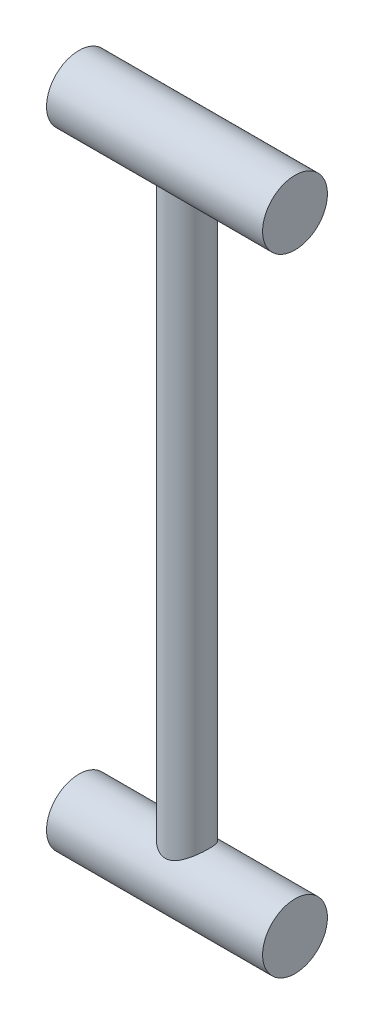
ISO-10303-21;
HEADER;
FILE_DESCRIPTION(('STEP AP214'),'2;1');
FILE_NAME('part.step','',(''),(''),'','','');
FILE_SCHEMA(('AUTOMOTIVE_DESIGN { 1 0 10303 214 1 1 1 1 }'));
ENDSEC;
DATA;
#1=APPLICATION_CONTEXT('core data for automotive mechanical design processes');
#2=APPLICATION_PROTOCOL_DEFINITION('international standard','automotive_design',2000,#1);
#3=PRODUCT_CONTEXT('',#1,'mechanical');
#4=PRODUCT('Part','Part','',(#3));
#5=PRODUCT_RELATED_PRODUCT_CATEGORY('part','',(#4));
#6=PRODUCT_DEFINITION_FORMATION('','',#4);
#7=PRODUCT_DEFINITION_CONTEXT('part definition',#1,'design');
#8=PRODUCT_DEFINITION('design','',#6,#7);
#9=PRODUCT_DEFINITION_SHAPE('','',#8);
#10=(LENGTH_UNIT() NAMED_UNIT(*) SI_UNIT(.MILLI.,.METRE.));
#11=(NAMED_UNIT(*) PLANE_ANGLE_UNIT() SI_UNIT($,.RADIAN.));
#12=(NAMED_UNIT(*) SI_UNIT($,.STERADIAN.) SOLID_ANGLE_UNIT());
#13=UNCERTAINTY_MEASURE_WITH_UNIT(LENGTH_MEASURE(1.E-05),#10,'distance_accuracy_value','');
#14=(GEOMETRIC_REPRESENTATION_CONTEXT(3) GLOBAL_UNCERTAINTY_ASSIGNED_CONTEXT((#13)) GLOBAL_UNIT_ASSIGNED_CONTEXT((#10,
#11,#12)) REPRESENTATION_CONTEXT('',''));
#15=CARTESIAN_POINT('',(0.,0.,0.));
#16=DIRECTION('',(0.,0.,1.));
#17=DIRECTION('',(1.,0.,0.));
#18=AXIS2_PLACEMENT_3D('',#15,#16,#17);
#19=CARTESIAN_POINT('',(50.,145.,0.));
#20=DIRECTION('',(-1.,0.,0.));
#21=DIRECTION('',(0.,0.,1.));
#22=AXIS2_PLACEMENT_3D('',#19,#20,#21);
#23=CYLINDRICAL_SURFACE('',#22,15.);
#24=CARTESIAN_POINT('',(0.,133.819660112501,10.));
#25=CARTESIAN_POINT('',(-0.244104634083735,133.819656974059,9.99999812169869));
#26=CARTESIAN_POINT('',(-0.488234877021475,133.811628913883,9.99104298688126));
#27=CARTESIAN_POINT('',(-0.974178674876098,133.779920593774,9.95541902056754));
#28=CARTESIAN_POINT('',(-1.21599185412102,133.75623783785,9.92874736433802));
#29=CARTESIAN_POINT('',(-1.69550479304913,133.694331734234,9.85819750719936));
#30=CARTESIAN_POINT('',(-1.93319895251672,133.65609000061,9.81429754720628));
#31=CARTESIAN_POINT('',(-2.40254294819922,133.566757899766,9.71008060552601));
#32=CARTESIAN_POINT('',(-2.63418959874925,133.515660905692,9.64975515521691));
#33=CARTESIAN_POINT('',(-3.3133509027849,133.347209971556,9.4468623449172));
#34=CARTESIAN_POINT('',(-3.75031310169313,133.21394511653,9.28157856239411));
#35=CARTESIAN_POINT('',(-4.5894545697837,132.920772054826,8.89665774912812));
#36=CARTESIAN_POINT('',(-4.99162659197015,132.760858317235,8.67700943055291));
#37=CARTESIAN_POINT('',(-5.59668354535961,132.498673505283,8.29133076792018));
#38=CARTESIAN_POINT('',(-5.81208580089952,132.400534017285,8.14175321020326));
#39=CARTESIAN_POINT('',(-6.22995308437643,132.202405118669,7.82663116288371));
#40=CARTESIAN_POINT('',(-6.43242046957811,132.102416049427,7.661089596458));
#41=CARTESIAN_POINT('',(-6.82407478250955,131.902687021171,7.314401504072));
#42=CARTESIAN_POINT('',(-7.01324763966898,131.802947430712,7.13323888356033));
#43=CARTESIAN_POINT('',(-7.37740647406724,131.605871214888,6.75593222846196));
#44=CARTESIAN_POINT('',(-7.55239147273011,131.508534755596,6.55978716230338));
#45=CARTESIAN_POINT('',(-7.91159105003275,131.30443976727,6.12353647276974));
#46=CARTESIAN_POINT('',(-8.09346990419511,131.198359251755,5.8811789501792));
#47=CARTESIAN_POINT('',(-8.43590832447264,130.994800859044,5.37846826366159));
#48=CARTESIAN_POINT('',(-8.59647059439671,130.897321891349,5.11811738840481));
#49=CARTESIAN_POINT('',(-8.89437994302583,130.713774422958,4.58085923760313));
#50=CARTESIAN_POINT('',(-9.03174359126861,130.627697787741,4.30396397184124));
#51=CARTESIAN_POINT('',(-9.28138637708527,130.469521563324,3.73526924944096));
#52=CARTESIAN_POINT('',(-9.39367088779998,130.397418980658,3.44347300179124));
#53=CARTESIAN_POINT('',(-9.58011201957958,130.276750022004,2.8808291650135));
#54=CARTESIAN_POINT('',(-9.6571320762623,130.226451130115,2.6113011354144));
#55=CARTESIAN_POINT('',(-9.78860194671832,130.140179643733,2.06453336890579));
#56=CARTESIAN_POINT('',(-9.84305328300618,130.10420608284,1.78729415354961));
#57=CARTESIAN_POINT('',(-9.9283487325306,130.047706245426,1.22794421558455));
#58=CARTESIAN_POINT('',(-9.95921755725901,130.027163799424,0.945838909986496));
#59=CARTESIAN_POINT('',(-9.99683236708492,130.002118348232,0.37932954212427));
#60=CARTESIAN_POINT('',(-10.0035817558104,129.997613079946,0.0949258098814422));
#61=CARTESIAN_POINT('',(-9.99365946358264,130.004226137376,-0.429890300704853));
#62=CARTESIAN_POINT('',(-9.98039844294295,130.013069367043,-0.670405365119607));
#63=CARTESIAN_POINT('',(-9.9366582762118,130.042162336069,-1.14916921336001));
#64=CARTESIAN_POINT('',(-9.9061795075949,130.062411825363,-1.38741804675311));
#65=CARTESIAN_POINT('',(-9.82842604583959,130.113861775101,-1.85994144315074));
#66=CARTESIAN_POINT('',(-9.78115152384267,130.14506212396,-2.09421604662547));
#67=CARTESIAN_POINT('',(-9.67041911018337,130.217738276032,-2.55727832292994));
#68=CARTESIAN_POINT('',(-9.60696051911227,130.259214523325,-2.78606575815929));
#69=CARTESIAN_POINT('',(-9.46491431896903,130.351392666098,-3.23586010547906));
#70=CARTESIAN_POINT('',(-9.38639206481311,130.402054658201,-3.45689591892769));
#71=CARTESIAN_POINT('',(-9.21483712594954,130.511767741304,-3.89118359906177));
#72=CARTESIAN_POINT('',(-9.1217996714918,130.57082158933,-4.10443287853566));
#73=CARTESIAN_POINT('',(-8.9221009344861,130.696229569888,-4.52213369992451));
#74=CARTESIAN_POINT('',(-8.81544331188517,130.762581740588,-4.72658758563684));
#75=CARTESIAN_POINT('',(-8.58926725934447,130.901505532484,-5.12613031066347));
#76=CARTESIAN_POINT('',(-8.46974423598901,130.974079373145,-5.32121576891783));
#77=CARTESIAN_POINT('',(-8.20216850951354,131.134120779227,-5.726327688562));
#78=CARTESIAN_POINT('',(-8.05242961838,131.222293886169,-5.93496271084411));
#79=CARTESIAN_POINT('',(-7.73843625985693,131.403421736346,-6.33893458542772));
#80=CARTESIAN_POINT('',(-7.57417532544927,131.496378602124,-6.53426544381383));
#81=CARTESIAN_POINT('',(-7.23178051029879,131.685412506263,-6.91131642999311));
#82=CARTESIAN_POINT('',(-7.05362705509659,131.781493831722,-7.09301661883702));
#83=CARTESIAN_POINT('',(-6.68441263242746,131.974769116281,-7.44198477597034));
#84=CARTESIAN_POINT('',(-6.49335589388961,132.071962702258,-7.60925743221258));
#85=CARTESIAN_POINT('',(-6.06811166266616,132.280625260595,-7.95387515273785));
#86=CARTESIAN_POINT('',(-5.83183895186575,132.391962114428,-8.12873711272969));
#87=CARTESIAN_POINT('',(-5.34336756923514,132.610333174891,-8.45784659868074));
#88=CARTESIAN_POINT('',(-5.09116533284389,132.717366409665,-8.61208948645936));
#89=CARTESIAN_POINT('',(-4.57196567585117,132.923321187221,-8.89859009264868));
#90=CARTESIAN_POINT('',(-4.30499239286442,133.022255344884,-9.03088234401941));
#91=CARTESIAN_POINT('',(-3.75668599376629,133.208212509585,-9.27237806459456));
#92=CARTESIAN_POINT('',(-3.47535220753653,133.295234960075,-9.38158045510896));
#93=CARTESIAN_POINT('',(-2.98197209563971,133.430512831538,-9.54750949240308));
#94=CARTESIAN_POINT('',(-2.77304680410481,133.482746477737,-9.61031997608976));
#95=CARTESIAN_POINT('',(-2.34953877611093,133.577312742453,-9.72253074540317));
#96=CARTESIAN_POINT('',(-2.13495975612472,133.619651693049,-9.77193961062347));
#97=CARTESIAN_POINT('',(-1.70139224710651,133.692959815119,-9.85667224549281));
#98=CARTESIAN_POINT('',(-1.48240961155063,133.723943147146,-9.89201356226248));
#99=CARTESIAN_POINT('',(-1.0411686827613,133.773424841791,-9.94813645210465));
#100=CARTESIAN_POINT('',(-0.818910376293255,133.791923153953,-9.96891796633514));
#101=CARTESIAN_POINT('',(-0.371800856476382,133.815716711929,-9.99560576163432));
#102=CARTESIAN_POINT('',(-0.146942530983491,133.820953374016,-10.0014460405136));
#103=CARTESIAN_POINT('',(0.302560059924553,133.817825352334,-9.99794852994014));
#104=CARTESIAN_POINT('',(0.527204324825155,133.809460635953,-9.98861070409458));
#105=CARTESIAN_POINT('',(0.974621641486342,133.779482245064,-9.95492255357889));
#106=CARTESIAN_POINT('',(1.19739324495087,133.757859128793,-9.93056153029915));
#107=CARTESIAN_POINT('',(1.6392693955759,133.702250566451,-9.86725009281896));
#108=CARTESIAN_POINT('',(1.85837388137278,133.668264913729,-9.82829943473768));
#109=CARTESIAN_POINT('',(2.28089485594373,133.591166988451,-9.73867716321877));
#110=CARTESIAN_POINT('',(2.48455237317498,133.548586961413,-9.6886776896265));
#111=CARTESIAN_POINT('',(2.88648788657469,133.454716026798,-9.57662600790572));
#112=CARTESIAN_POINT('',(3.0847640261608,133.403422156147,-9.51456969891008));
#113=CARTESIAN_POINT('',(3.67047748529837,133.238532118733,-9.31119036842247));
#114=CARTESIAN_POINT('',(4.04901435576878,133.11388587182,-9.15261057859001));
#115=CARTESIAN_POINT('',(4.6323431509614,132.899707113,-8.86571968225688));
#116=CARTESIAN_POINT('',(4.84610463934114,132.816053741096,-8.75064580817112));
#117=CARTESIAN_POINT('',(5.26341966050908,132.644132046518,-8.50616497543067));
#118=CARTESIAN_POINT('',(5.46697225451772,132.555863300946,-8.37675670212528));
#119=CARTESIAN_POINT('',(5.86362637103519,132.376578677965,-8.10406654501132));
#120=CARTESIAN_POINT('',(6.05671627224182,132.285559913918,-7.96076970794571));
#121=CARTESIAN_POINT('',(6.43184385461758,132.10264331109,-7.66087764301208));
#122=CARTESIAN_POINT('',(6.61388092093514,132.010745423734,-7.50428167649492));
#123=CARTESIAN_POINT('',(7.00501199367109,131.807712398299,-7.14251026043374));
#124=CARTESIAN_POINT('',(7.21131788333415,131.696764999883,-6.93419991939919));
#125=CARTESIAN_POINT('',(7.605813647227,131.478854545019,-6.49906525353763));
#126=CARTESIAN_POINT('',(7.79400018787884,131.371892223951,-6.2722375360349));
#127=CARTESIAN_POINT('',(8.15079051936008,131.164743985722,-5.80102421685025));
#128=CARTESIAN_POINT('',(8.3194077996857,131.064553420786,-5.55665090006567));
#129=CARTESIAN_POINT('',(8.63560945832402,130.873504197794,-5.05124190702963));
#130=CARTESIAN_POINT('',(8.78319947641232,130.782643039307,-4.79021072592578));
#131=CARTESIAN_POINT('',(9.0294319874341,130.629082892862,-4.30448556628465));
#132=CARTESIAN_POINT('',(9.13203130163218,130.564326574372,-4.08244035052508));
#133=CARTESIAN_POINT('',(9.32137816893596,130.443806961212,-3.62934795833054));
#134=CARTESIAN_POINT('',(9.40812868268456,130.388041987138,-3.39830247299898));
#135=CARTESIAN_POINT('',(9.564772630882,130.286696133979,-2.92854633040624));
#136=CARTESIAN_POINT('',(9.63467675373536,130.241108798922,-2.68984064278836));
#137=CARTESIAN_POINT('',(9.75681098257684,130.161090664085,-2.20609679271157));
#138=CARTESIAN_POINT('',(9.80904083216604,130.126660026155,-1.96105853844224));
#139=CARTESIAN_POINT('',(9.89528026301976,130.069644401242,-1.46527060531758));
#140=CARTESIAN_POINT('',(9.92920666361757,130.047113502631,-1.21450016236396));
#141=CARTESIAN_POINT('',(9.97795750179072,130.014697088045,-0.710289408341561));
#142=CARTESIAN_POINT('',(9.9927819091241,130.004811592091,-0.456849093046524));
#143=CARTESIAN_POINT('',(10.0030913961553,129.997939380006,0.0505846961655423));
#144=CARTESIAN_POINT('',(9.99857762795915,130.000951895452,0.304578136228092));
#145=CARTESIAN_POINT('',(9.97028527280906,130.019797187459,0.810999942975637));
#146=CARTESIAN_POINT('',(9.94650756259925,130.035629380569,1.06342838036049));
#147=CARTESIAN_POINT('',(9.88248971342065,130.078100716761,1.54639987516089));
#148=CARTESIAN_POINT('',(9.84357507465467,130.103868536299,1.77719759813669));
#149=CARTESIAN_POINT('',(9.75001605952978,130.165527474989,2.23418451613698));
#150=CARTESIAN_POINT('',(9.69537259751012,130.20141800569,2.46037397822816));
#151=CARTESIAN_POINT('',(9.5710083281068,130.282595919454,2.90680088706522));
#152=CARTESIAN_POINT('',(9.50128911523188,130.327882308729,3.12703896049922));
#153=CARTESIAN_POINT('',(9.34748470402443,130.427010844309,3.56054098474613));
#154=CARTESIAN_POINT('',(9.26339391189295,130.480856321463,3.7738021813197));
#155=CARTESIAN_POINT('',(9.07643294016643,130.599440490844,4.20435065529124));
#156=CARTESIAN_POINT('',(8.97276186320523,130.66462705576,4.42116634154644));
#157=CARTESIAN_POINT('',(8.75114745704071,130.802287559172,4.84506473833996));
#158=CARTESIAN_POINT('',(8.63319816311674,130.874764541086,5.05214333070679));
#159=CARTESIAN_POINT('',(8.38391755943983,131.025729635485,5.45584279844941));
#160=CARTESIAN_POINT('',(8.25258314335167,131.104219142266,5.65246123010943));
#161=CARTESIAN_POINT('',(7.97735246721628,131.265891065643,6.03467657516068));
#162=CARTESIAN_POINT('',(7.83345479961898,131.349074007709,6.22027224967031));
#163=CARTESIAN_POINT('',(7.51020568644261,131.532158785367,6.60834585726704));
#164=CARTESIAN_POINT('',(7.32883957137959,131.632630640526,6.80887991263904));
#165=CARTESIAN_POINT('',(6.95120233992228,131.835886231142,7.19399132903166));
#166=CARTESIAN_POINT('',(6.75493436648316,131.938669475903,7.37857203731308));
#167=CARTESIAN_POINT('',(6.34800274615306,132.144406305686,7.73145903758045));
#168=CARTESIAN_POINT('',(6.13732629941372,132.247359960757,7.89975052986546));
#169=CARTESIAN_POINT('',(5.70233922468843,132.450907297695,8.21925441084574));
#170=CARTESIAN_POINT('',(5.47802992036077,132.551501207367,8.37046845358406));
#171=CARTESIAN_POINT('',(5.03390836898575,132.740188636846,8.6442187927183));
#172=CARTESIAN_POINT('',(4.81505896437095,132.828650299424,8.76806290035353));
#173=CARTESIAN_POINT('',(4.36657776521144,132.999000765507,8.99981674145526));
#174=CARTESIAN_POINT('',(4.13694564645788,133.080889371175,9.10772599539628));
#175=CARTESIAN_POINT('',(3.66788226081282,133.235459337208,9.30652559170291));
#176=CARTESIAN_POINT('',(3.42846735367455,133.308155298701,9.397443035655));
#177=CARTESIAN_POINT('',(2.94041923146927,133.441840049654,9.56138824931114));
#178=CARTESIAN_POINT('',(2.69178854788988,133.502832026068,9.6344208904837));
#179=CARTESIAN_POINT('',(2.24269134510791,133.598562973724,9.74738067057191));
#180=CARTESIAN_POINT('',(2.04376372943438,133.636124470953,9.79105763878781));
#181=CARTESIAN_POINT('',(1.64207066548913,133.70145343441,9.8663741573746));
#182=CARTESIAN_POINT('',(1.43930597879831,133.72922282313,9.89801607069264));
#183=CARTESIAN_POINT('',(1.03112886292084,133.774043007556,9.94882125186978));
#184=CARTESIAN_POINT('',(0.825717714652385,133.791098803548,9.96799034124066));
#185=CARTESIAN_POINT('',(0.413543541943234,133.813906923323,9.99357852338843));
#186=CARTESIAN_POINT('',(0.206780959145198,133.819662771074,10.0000015911085));
#187=CARTESIAN_POINT('',(0.,133.819660112501,10.));
#188=B_SPLINE_CURVE_WITH_KNOTS('',3,(#24,#25,#26,#27,#28,#29,#30,#31,#32,#33,#34,#35,#36,#37,
#38,#39,#40,#41,#42,#43,#44,#45,#46,#47,#48,#49,#50,#51,#52,#53,#54,#55,#56,#57,#58,#59,#60,#61,
#62,#63,#64,#65,#66,#67,#68,#69,#70,#71,#72,#73,#74,#75,#76,#77,#78,#79,#80,#81,#82,#83,#84,#85,
#86,#87,#88,#89,#90,#91,#92,#93,#94,#95,#96,#97,#98,#99,#100,#101,#102,#103,#104,#105,#106,#107,
#108,#109,#110,#111,#112,#113,#114,#115,#116,#117,#118,#119,#120,#121,#122,#123,#124,#125,#126,
#127,#128,#129,#130,#131,#132,#133,#134,#135,#136,#137,#138,#139,#140,#141,#142,#143,#144,#145,
#146,#147,#148,#149,#150,#151,#152,#153,#154,#155,#156,#157,#158,#159,#160,#161,#162,#163,#164,
#165,#166,#167,#168,#169,#170,#171,#172,#173,#174,#175,#176,#177,#178,#179,#180,#181,#182,#183,
#184,#185,#186,#187),.UNSPECIFIED.,.T.,.F.,(4,2,2,2,2,2,2,2,2,2,2,2,2,2,2,2,2,2,2,2,2,2,2,2,2,2,
2,2,2,2,2,2,2,2,2,2,2,2,2,2,2,2,2,2,2,2,2,2,2,2,2,2,2,2,2,2,2,2,2,2,2,2,2,2,2,2,2,2,2,2,2,2,2,2,
2,2,2,2,2,2,2,4),(0.,0.732066917349114,1.46425058392996,2.19736197880352,2.93085206787207,
4.38202011265699,5.83348971990308,6.67283897692401,7.51203483110184,8.35210589301703,
9.19223484776161,10.1540803360741,11.1158037065051,12.0768372372204,13.0376646710422,
13.8907601737504,14.743798116181,15.5959409519091,16.4479635322652,17.1702156788431,
17.8924519916876,18.6146809454662,19.3369411162915,20.0561358131717,20.7755673398783,
21.4948059495621,22.214302210737,23.0280693671007,23.8422007569148,24.6575007309406,
25.4725347827911,26.414397305266,27.356471340832,28.2970489476923,29.2376704858531,
29.9100432897782,30.5819846253405,31.253085170213,31.9241884272577,32.5982511716858,
33.2723155323322,33.946860475926,34.6214166957388,35.2627334392751,35.9042686956598,
37.1866749927096,37.9564914842845,38.7263786365849,39.4971041032807,40.267872404997,
41.207188569845,42.1466772201538,43.0855143659072,44.0240992277863,44.7824339087838,
45.5406267835279,46.2983373392933,47.056058886619,47.8171955242766,48.5783333669519,
49.3394258641229,50.1004837242549,50.806097715443,51.5116706965499,52.2171690881724,
52.922942706437,53.6692292388338,54.4158286150965,55.1626016537188,55.9094584662437,
56.7739254797705,57.6382106720937,58.5032738884594,59.3682532468017,60.1672315187865,
60.9662338294223,61.7639506641025,62.5614499741256,63.1821889251969,63.8028059381941,
64.4231330789218,65.0432667355241),.UNSPECIFIED.);
#189=CARTESIAN_POINT('',(0.,133.819660112501,10.));
#190=VERTEX_POINT('',#189);
#191=EDGE_CURVE('E42',#190,#190,#188,.T.);
#192=ORIENTED_EDGE('',*,*,#191,.F.);
#193=EDGE_LOOP('',(#192));
#194=FACE_BOUND('',#193,.T.);
#195=CARTESIAN_POINT('',(50.,145.,0.));
#196=DIRECTION('',(1.,0.,0.));
#197=DIRECTION('',(0.,0.,-1.));
#198=AXIS2_PLACEMENT_3D('',#195,#196,#197);
#199=CIRCLE('',#198,15.);
#200=CARTESIAN_POINT('',(50.,145.,-15.));
#201=VERTEX_POINT('',#200);
#202=EDGE_CURVE('E46',#201,#201,#199,.T.);
#203=ORIENTED_EDGE('',*,*,#202,.F.);
#204=EDGE_LOOP('',(#203));
#205=FACE_BOUND('',#204,.T.);
#206=CARTESIAN_POINT('',(-50.,145.,0.));
#207=DIRECTION('',(1.,0.,0.));
#208=DIRECTION('',(0.,0.,-1.));
#209=AXIS2_PLACEMENT_3D('',#206,#207,#208);
#210=CIRCLE('',#209,15.);
#211=CARTESIAN_POINT('',(-50.,145.,-15.));
#212=VERTEX_POINT('',#211);
#213=EDGE_CURVE('E50',#212,#212,#210,.T.);
#214=ORIENTED_EDGE('',*,*,#213,.T.);
#215=EDGE_LOOP('',(#214));
#216=FACE_BOUND('',#215,.T.);
#217=ADVANCED_FACE('F31',(#194,#205,#216),#23,.T.);
#218=CARTESIAN_POINT('',(50.,145.,0.));
#219=DIRECTION('',(1.,0.,0.));
#220=DIRECTION('',(0.,0.,-1.));
#221=AXIS2_PLACEMENT_3D('',#218,#219,#220);
#222=PLANE('',#221);
#223=ORIENTED_EDGE('',*,*,#202,.T.);
#224=EDGE_LOOP('',(#223));
#225=FACE_BOUND('',#224,.T.);
#226=ADVANCED_FACE('F58',(#225),#222,.T.);
#227=CARTESIAN_POINT('',(-50.,145.,0.));
#228=DIRECTION('',(1.,0.,0.));
#229=DIRECTION('',(0.,0.,-1.));
#230=AXIS2_PLACEMENT_3D('',#227,#228,#229);
#231=PLANE('',#230);
#232=ORIENTED_EDGE('',*,*,#213,.F.);
#233=EDGE_LOOP('',(#232));
#234=FACE_BOUND('',#233,.T.);
#235=ADVANCED_FACE('F60',(#234),#231,.F.);
#236=CARTESIAN_POINT('',(0.,145.,0.));
#237=DIRECTION('',(0.,1.,0.));
#238=DIRECTION('',(0.,0.,1.));
#239=AXIS2_PLACEMENT_3D('',#236,#237,#238);
#240=CYLINDRICAL_SURFACE('',#239,10.);
#241=CARTESIAN_POINT('',(0.,-133.819660112501,10.));
#242=CARTESIAN_POINT('',(-0.244104634083735,-133.819656974059,9.99999812169869));
#243=CARTESIAN_POINT('',(-0.488234877021475,-133.811628913883,9.99104298688126));
#244=CARTESIAN_POINT('',(-0.974178674876098,-133.779920593774,9.95541902056754));
#245=CARTESIAN_POINT('',(-1.21599185412102,-133.75623783785,9.92874736433802));
#246=CARTESIAN_POINT('',(-1.69550479304913,-133.694331734234,9.85819750719936));
#247=CARTESIAN_POINT('',(-1.93319895251672,-133.65609000061,9.81429754720628));
#248=CARTESIAN_POINT('',(-2.40254294819922,-133.566757899766,9.71008060552601));
#249=CARTESIAN_POINT('',(-2.63418959874925,-133.515660905692,9.64975515521691));
#250=CARTESIAN_POINT('',(-3.3133509027849,-133.347209971556,9.4468623449172));
#251=CARTESIAN_POINT('',(-3.75031310169313,-133.21394511653,9.28157856239411));
#252=CARTESIAN_POINT('',(-4.5894545697837,-132.920772054826,8.89665774912812));
#253=CARTESIAN_POINT('',(-4.99162659197015,-132.760858317235,8.67700943055291));
#254=CARTESIAN_POINT('',(-5.59668354535961,-132.498673505283,8.29133076792018));
#255=CARTESIAN_POINT('',(-5.81208580089952,-132.400534017285,8.14175321020326));
#256=CARTESIAN_POINT('',(-6.22995308437643,-132.202405118669,7.82663116288371));
#257=CARTESIAN_POINT('',(-6.43242046957811,-132.102416049427,7.661089596458));
#258=CARTESIAN_POINT('',(-6.82407478250955,-131.902687021171,7.314401504072));
#259=CARTESIAN_POINT('',(-7.01324763966898,-131.802947430712,7.13323888356033));
#260=CARTESIAN_POINT('',(-7.37740647406724,-131.605871214888,6.75593222846196));
#261=CARTESIAN_POINT('',(-7.55239147273011,-131.508534755596,6.55978716230338));
#262=CARTESIAN_POINT('',(-7.91159105003275,-131.30443976727,6.12353647276974));
#263=CARTESIAN_POINT('',(-8.09346990419511,-131.198359251755,5.8811789501792));
#264=CARTESIAN_POINT('',(-8.43590832447264,-130.994800859044,5.37846826366159));
#265=CARTESIAN_POINT('',(-8.59647059439671,-130.897321891349,5.11811738840481));
#266=CARTESIAN_POINT('',(-8.89437994302583,-130.713774422958,4.58085923760313));
#267=CARTESIAN_POINT('',(-9.03174359126861,-130.627697787741,4.30396397184124));
#268=CARTESIAN_POINT('',(-9.28138637708527,-130.469521563324,3.73526924944096));
#269=CARTESIAN_POINT('',(-9.39367088779998,-130.397418980658,3.44347300179124));
#270=CARTESIAN_POINT('',(-9.58011201957958,-130.276750022004,2.8808291650135));
#271=CARTESIAN_POINT('',(-9.6571320762623,-130.226451130115,2.6113011354144));
#272=CARTESIAN_POINT('',(-9.78860194671832,-130.140179643733,2.06453336890579));
#273=CARTESIAN_POINT('',(-9.84305328300618,-130.10420608284,1.78729415354961));
#274=CARTESIAN_POINT('',(-9.9283487325306,-130.047706245426,1.22794421558455));
#275=CARTESIAN_POINT('',(-9.95921755725901,-130.027163799424,0.945838909986496));
#276=CARTESIAN_POINT('',(-9.99683236708492,-130.002118348232,0.37932954212427));
#277=CARTESIAN_POINT('',(-10.0035817558104,-129.997613079946,0.0949258098814422));
#278=CARTESIAN_POINT('',(-9.99365946358264,-130.004226137376,-0.429890300704853));
#279=CARTESIAN_POINT('',(-9.98039844294295,-130.013069367043,-0.670405365119607));
#280=CARTESIAN_POINT('',(-9.9366582762118,-130.042162336069,-1.14916921336001));
#281=CARTESIAN_POINT('',(-9.9061795075949,-130.062411825363,-1.38741804675311));
#282=CARTESIAN_POINT('',(-9.82842604583959,-130.113861775101,-1.85994144315074));
#283=CARTESIAN_POINT('',(-9.78115152384267,-130.14506212396,-2.09421604662547));
#284=CARTESIAN_POINT('',(-9.67041911018337,-130.217738276032,-2.55727832292994));
#285=CARTESIAN_POINT('',(-9.60696051911227,-130.259214523325,-2.78606575815929));
#286=CARTESIAN_POINT('',(-9.46491431896903,-130.351392666098,-3.23586010547906));
#287=CARTESIAN_POINT('',(-9.38639206481311,-130.402054658201,-3.45689591892769));
#288=CARTESIAN_POINT('',(-9.21483712594954,-130.511767741304,-3.89118359906177));
#289=CARTESIAN_POINT('',(-9.1217996714918,-130.57082158933,-4.10443287853566));
#290=CARTESIAN_POINT('',(-8.9221009344861,-130.696229569888,-4.52213369992451));
#291=CARTESIAN_POINT('',(-8.81544331188517,-130.762581740588,-4.72658758563684));
#292=CARTESIAN_POINT('',(-8.58926725934447,-130.901505532484,-5.12613031066347));
#293=CARTESIAN_POINT('',(-8.46974423598901,-130.974079373145,-5.32121576891783));
#294=CARTESIAN_POINT('',(-8.20216850951354,-131.134120779227,-5.726327688562));
#295=CARTESIAN_POINT('',(-8.05242961838,-131.222293886169,-5.93496271084411));
#296=CARTESIAN_POINT('',(-7.73843625985693,-131.403421736346,-6.33893458542772));
#297=CARTESIAN_POINT('',(-7.57417532544927,-131.496378602124,-6.53426544381383));
#298=CARTESIAN_POINT('',(-7.23178051029879,-131.685412506263,-6.91131642999311));
#299=CARTESIAN_POINT('',(-7.05362705509659,-131.781493831722,-7.09301661883702));
#300=CARTESIAN_POINT('',(-6.68441263242746,-131.974769116281,-7.44198477597034));
#301=CARTESIAN_POINT('',(-6.49335589388961,-132.071962702258,-7.60925743221258));
#302=CARTESIAN_POINT('',(-6.06811166266616,-132.280625260595,-7.95387515273785));
#303=CARTESIAN_POINT('',(-5.83183895186575,-132.391962114428,-8.12873711272969));
#304=CARTESIAN_POINT('',(-5.34336756923514,-132.610333174891,-8.45784659868074));
#305=CARTESIAN_POINT('',(-5.09116533284389,-132.717366409665,-8.61208948645936));
#306=CARTESIAN_POINT('',(-4.57196567585117,-132.923321187221,-8.89859009264868));
#307=CARTESIAN_POINT('',(-4.30499239286442,-133.022255344884,-9.03088234401941));
#308=CARTESIAN_POINT('',(-3.75668599376629,-133.208212509585,-9.27237806459456));
#309=CARTESIAN_POINT('',(-3.47535220753653,-133.295234960075,-9.38158045510896));
#310=CARTESIAN_POINT('',(-2.98197209563971,-133.430512831538,-9.54750949240308));
#311=CARTESIAN_POINT('',(-2.77304680410481,-133.482746477737,-9.61031997608976));
#312=CARTESIAN_POINT('',(-2.34953877611093,-133.577312742453,-9.72253074540317));
#313=CARTESIAN_POINT('',(-2.13495975612472,-133.619651693049,-9.77193961062347));
#314=CARTESIAN_POINT('',(-1.70139224710651,-133.692959815119,-9.85667224549281));
#315=CARTESIAN_POINT('',(-1.48240961155063,-133.723943147146,-9.89201356226248));
#316=CARTESIAN_POINT('',(-1.0411686827613,-133.773424841791,-9.94813645210465));
#317=CARTESIAN_POINT('',(-0.818910376293255,-133.791923153953,-9.96891796633514));
#318=CARTESIAN_POINT('',(-0.371800856476382,-133.815716711929,-9.99560576163432));
#319=CARTESIAN_POINT('',(-0.146942530983491,-133.820953374016,-10.0014460405136));
#320=CARTESIAN_POINT('',(0.302560059924553,-133.817825352334,-9.99794852994014));
#321=CARTESIAN_POINT('',(0.527204324825155,-133.809460635953,-9.98861070409458));
#322=CARTESIAN_POINT('',(0.974621641486342,-133.779482245064,-9.95492255357889));
#323=CARTESIAN_POINT('',(1.19739324495087,-133.757859128793,-9.93056153029915));
#324=CARTESIAN_POINT('',(1.6392693955759,-133.702250566451,-9.86725009281896));
#325=CARTESIAN_POINT('',(1.85837388137278,-133.668264913729,-9.82829943473768));
#326=CARTESIAN_POINT('',(2.28089485594373,-133.591166988451,-9.73867716321877));
#327=CARTESIAN_POINT('',(2.48455237317498,-133.548586961413,-9.6886776896265));
#328=CARTESIAN_POINT('',(2.88648788657469,-133.454716026798,-9.57662600790572));
#329=CARTESIAN_POINT('',(3.0847640261608,-133.403422156147,-9.51456969891008));
#330=CARTESIAN_POINT('',(3.67047748529837,-133.238532118733,-9.31119036842247));
#331=CARTESIAN_POINT('',(4.04901435576878,-133.11388587182,-9.15261057859001));
#332=CARTESIAN_POINT('',(4.6323431509614,-132.899707113,-8.86571968225688));
#333=CARTESIAN_POINT('',(4.84610463934114,-132.816053741096,-8.75064580817112));
#334=CARTESIAN_POINT('',(5.26341966050908,-132.644132046518,-8.50616497543067));
#335=CARTESIAN_POINT('',(5.46697225451772,-132.555863300946,-8.37675670212528));
#336=CARTESIAN_POINT('',(5.86362637103519,-132.376578677965,-8.10406654501132));
#337=CARTESIAN_POINT('',(6.05671627224182,-132.285559913918,-7.96076970794571));
#338=CARTESIAN_POINT('',(6.43184385461758,-132.10264331109,-7.66087764301208));
#339=CARTESIAN_POINT('',(6.61388092093514,-132.010745423734,-7.50428167649492));
#340=CARTESIAN_POINT('',(7.00501199367109,-131.807712398299,-7.14251026043374));
#341=CARTESIAN_POINT('',(7.21131788333415,-131.696764999883,-6.93419991939919));
#342=CARTESIAN_POINT('',(7.605813647227,-131.478854545019,-6.49906525353763));
#343=CARTESIAN_POINT('',(7.79400018787884,-131.371892223951,-6.2722375360349));
#344=CARTESIAN_POINT('',(8.15079051936008,-131.164743985722,-5.80102421685025));
#345=CARTESIAN_POINT('',(8.3194077996857,-131.064553420786,-5.55665090006567));
#346=CARTESIAN_POINT('',(8.63560945832402,-130.873504197794,-5.05124190702963));
#347=CARTESIAN_POINT('',(8.78319947641232,-130.782643039307,-4.79021072592578));
#348=CARTESIAN_POINT('',(9.0294319874341,-130.629082892862,-4.30448556628465));
#349=CARTESIAN_POINT('',(9.13203130163218,-130.564326574372,-4.08244035052508));
#350=CARTESIAN_POINT('',(9.32137816893596,-130.443806961212,-3.62934795833054));
#351=CARTESIAN_POINT('',(9.40812868268456,-130.388041987138,-3.39830247299898));
#352=CARTESIAN_POINT('',(9.564772630882,-130.286696133979,-2.92854633040624));
#353=CARTESIAN_POINT('',(9.63467675373536,-130.241108798922,-2.68984064278836));
#354=CARTESIAN_POINT('',(9.75681098257684,-130.161090664085,-2.20609679271157));
#355=CARTESIAN_POINT('',(9.80904083216604,-130.126660026155,-1.96105853844224));
#356=CARTESIAN_POINT('',(9.89528026301976,-130.069644401242,-1.46527060531758));
#357=CARTESIAN_POINT('',(9.92920666361757,-130.047113502631,-1.21450016236396));
#358=CARTESIAN_POINT('',(9.97795750179072,-130.014697088045,-0.710289408341561));
#359=CARTESIAN_POINT('',(9.9927819091241,-130.004811592091,-0.456849093046524));
#360=CARTESIAN_POINT('',(10.0030913961553,-129.997939380006,0.0505846961655423));
#361=CARTESIAN_POINT('',(9.99857762795915,-130.000951895452,0.304578136228092));
#362=CARTESIAN_POINT('',(9.97028527280906,-130.019797187459,0.810999942975637));
#363=CARTESIAN_POINT('',(9.94650756259925,-130.035629380569,1.06342838036049));
#364=CARTESIAN_POINT('',(9.88248971342065,-130.078100716761,1.54639987516089));
#365=CARTESIAN_POINT('',(9.84357507465467,-130.103868536299,1.77719759813669));
#366=CARTESIAN_POINT('',(9.75001605952978,-130.165527474989,2.23418451613698));
#367=CARTESIAN_POINT('',(9.69537259751012,-130.20141800569,2.46037397822816));
#368=CARTESIAN_POINT('',(9.5710083281068,-130.282595919454,2.90680088706522));
#369=CARTESIAN_POINT('',(9.50128911523188,-130.327882308729,3.12703896049922));
#370=CARTESIAN_POINT('',(9.34748470402443,-130.427010844309,3.56054098474613));
#371=CARTESIAN_POINT('',(9.26339391189295,-130.480856321463,3.7738021813197));
#372=CARTESIAN_POINT('',(9.07643294016643,-130.599440490844,4.20435065529124));
#373=CARTESIAN_POINT('',(8.97276186320523,-130.66462705576,4.42116634154644));
#374=CARTESIAN_POINT('',(8.75114745704071,-130.802287559172,4.84506473833996));
#375=CARTESIAN_POINT('',(8.63319816311674,-130.874764541086,5.05214333070679));
#376=CARTESIAN_POINT('',(8.38391755943983,-131.025729635485,5.45584279844941));
#377=CARTESIAN_POINT('',(8.25258314335167,-131.104219142266,5.65246123010943));
#378=CARTESIAN_POINT('',(7.97735246721628,-131.265891065643,6.03467657516068));
#379=CARTESIAN_POINT('',(7.83345479961898,-131.349074007709,6.22027224967031));
#380=CARTESIAN_POINT('',(7.51020568644261,-131.532158785367,6.60834585726704));
#381=CARTESIAN_POINT('',(7.32883957137959,-131.632630640526,6.80887991263904));
#382=CARTESIAN_POINT('',(6.95120233992228,-131.835886231142,7.19399132903166));
#383=CARTESIAN_POINT('',(6.75493436648316,-131.938669475903,7.37857203731308));
#384=CARTESIAN_POINT('',(6.34800274615306,-132.144406305686,7.73145903758045));
#385=CARTESIAN_POINT('',(6.13732629941372,-132.247359960757,7.89975052986546));
#386=CARTESIAN_POINT('',(5.70233922468843,-132.450907297695,8.21925441084574));
#387=CARTESIAN_POINT('',(5.47802992036077,-132.551501207367,8.37046845358406));
#388=CARTESIAN_POINT('',(5.03390836898575,-132.740188636846,8.6442187927183));
#389=CARTESIAN_POINT('',(4.81505896437095,-132.828650299424,8.76806290035353));
#390=CARTESIAN_POINT('',(4.36657776521144,-132.999000765507,8.99981674145526));
#391=CARTESIAN_POINT('',(4.13694564645788,-133.080889371175,9.10772599539628));
#392=CARTESIAN_POINT('',(3.66788226081282,-133.235459337208,9.30652559170291));
#393=CARTESIAN_POINT('',(3.42846735367455,-133.308155298701,9.397443035655));
#394=CARTESIAN_POINT('',(2.94041923146927,-133.441840049654,9.56138824931114));
#395=CARTESIAN_POINT('',(2.69178854788988,-133.502832026068,9.6344208904837));
#396=CARTESIAN_POINT('',(2.24269134510791,-133.598562973724,9.74738067057191));
#397=CARTESIAN_POINT('',(2.04376372943438,-133.636124470953,9.79105763878781));
#398=CARTESIAN_POINT('',(1.64207066548913,-133.70145343441,9.8663741573746));
#399=CARTESIAN_POINT('',(1.43930597879831,-133.72922282313,9.89801607069264));
#400=CARTESIAN_POINT('',(1.03112886292084,-133.774043007556,9.94882125186978));
#401=CARTESIAN_POINT('',(0.825717714652385,-133.791098803548,9.96799034124066));
#402=CARTESIAN_POINT('',(0.413543541943234,-133.813906923323,9.99357852338843));
#403=CARTESIAN_POINT('',(0.206780959145198,-133.819662771074,10.0000015911085));
#404=CARTESIAN_POINT('',(0.,-133.819660112501,10.));
#405=B_SPLINE_CURVE_WITH_KNOTS('',3,(#241,#242,#243,#244,#245,#246,#247,#248,#249,#250,#251,
#252,#253,#254,#255,#256,#257,#258,#259,#260,#261,#262,#263,#264,#265,#266,#267,#268,#269,#270,
#271,#272,#273,#274,#275,#276,#277,#278,#279,#280,#281,#282,#283,#284,#285,#286,#287,#288,#289,
#290,#291,#292,#293,#294,#295,#296,#297,#298,#299,#300,#301,#302,#303,#304,#305,#306,#307,#308,
#309,#310,#311,#312,#313,#314,#315,#316,#317,#318,#319,#320,#321,#322,#323,#324,#325,#326,#327,
#328,#329,#330,#331,#332,#333,#334,#335,#336,#337,#338,#339,#340,#341,#342,#343,#344,#345,#346,
#347,#348,#349,#350,#351,#352,#353,#354,#355,#356,#357,#358,#359,#360,#361,#362,#363,#364,#365,
#366,#367,#368,#369,#370,#371,#372,#373,#374,#375,#376,#377,#378,#379,#380,#381,#382,#383,#384,
#385,#386,#387,#388,#389,#390,#391,#392,#393,#394,#395,#396,#397,#398,#399,#400,#401,#402,#403,
#404),.UNSPECIFIED.,.T.,.F.,(4,2,2,2,2,2,2,2,2,2,2,2,2,2,2,2,2,2,2,2,2,2,2,2,2,2,2,2,2,2,2,2,2,
2,2,2,2,2,2,2,2,2,2,2,2,2,2,2,2,2,2,2,2,2,2,2,2,2,2,2,2,2,2,2,2,2,2,2,2,2,2,2,2,2,2,2,2,2,2,2,2,
4),(0.,0.732066917349114,1.46425058392996,2.19736197880352,2.93085206787207,4.38202011265699,
5.83348971990308,6.67283897692401,7.51203483110184,8.35210589301703,9.19223484776161,
10.1540803360741,11.1158037065051,12.0768372372204,13.0376646710422,13.8907601737504,
14.743798116181,15.5959409519091,16.4479635322652,17.1702156788431,17.8924519916876,
18.6146809454662,19.3369411162915,20.0561358131717,20.7755673398783,21.4948059495621,
22.214302210737,23.0280693671007,23.8422007569148,24.6575007309406,25.4725347827911,
26.414397305266,27.356471340832,28.2970489476923,29.2376704858531,29.9100432897782,
30.5819846253405,31.253085170213,31.9241884272577,32.5982511716858,33.2723155323322,
33.946860475926,34.6214166957388,35.2627334392751,35.9042686956598,37.1866749927096,
37.9564914842845,38.7263786365849,39.4971041032807,40.267872404997,41.207188569845,
42.1466772201538,43.0855143659072,44.0240992277863,44.7824339087838,45.5406267835279,
46.2983373392933,47.056058886619,47.8171955242766,48.5783333669519,49.3394258641229,
50.1004837242549,50.806097715443,51.5116706965499,52.2171690881724,52.922942706437,
53.6692292388338,54.4158286150965,55.1626016537188,55.9094584662437,56.7739254797705,
57.6382106720937,58.5032738884594,59.3682532468017,60.1672315187865,60.9662338294223,
61.7639506641025,62.5614499741256,63.1821889251969,63.8028059381941,64.4231330789218,
65.0432667355241),.UNSPECIFIED.);
#406=CARTESIAN_POINT('',(0.,-133.819660112501,10.));
#407=VERTEX_POINT('',#406);
#408=EDGE_CURVE('E10',#407,#407,#405,.T.);
#409=ORIENTED_EDGE('',*,*,#408,.F.);
#410=EDGE_LOOP('',(#409));
#411=FACE_BOUND('',#410,.T.);
#412=ORIENTED_EDGE('',*,*,#191,.T.);
#413=EDGE_LOOP('',(#412));
#414=FACE_BOUND('',#413,.T.);
#415=ADVANCED_FACE('F33',(#411,#414),#240,.T.);
#416=CARTESIAN_POINT('',(50.,-145.,0.));
#417=DIRECTION('',(-1.,0.,0.));
#418=DIRECTION('',(0.,0.,1.));
#419=AXIS2_PLACEMENT_3D('',#416,#417,#418);
#420=CYLINDRICAL_SURFACE('',#419,15.);
#421=ORIENTED_EDGE('',*,*,#408,.T.);
#422=EDGE_LOOP('',(#421));
#423=FACE_BOUND('',#422,.T.);
#424=CARTESIAN_POINT('',(50.,-145.,0.));
#425=DIRECTION('',(-1.,0.,0.));
#426=DIRECTION('',(0.,0.,-1.));
#427=AXIS2_PLACEMENT_3D('',#424,#425,#426);
#428=CIRCLE('',#427,15.);
#429=CARTESIAN_POINT('',(50.,-145.,-15.));
#430=VERTEX_POINT('',#429);
#431=EDGE_CURVE('E81',#430,#430,#428,.T.);
#432=ORIENTED_EDGE('',*,*,#431,.T.);
#433=EDGE_LOOP('',(#432));
#434=FACE_BOUND('',#433,.T.);
#435=CARTESIAN_POINT('',(-50.,-145.,0.));
#436=DIRECTION('',(-1.,0.,0.));
#437=DIRECTION('',(0.,0.,-1.));
#438=AXIS2_PLACEMENT_3D('',#435,#436,#437);
#439=CIRCLE('',#438,15.);
#440=CARTESIAN_POINT('',(-50.,-145.,-15.));
#441=VERTEX_POINT('',#440);
#442=EDGE_CURVE('E83',#441,#441,#439,.T.);
#443=ORIENTED_EDGE('',*,*,#442,.F.);
#444=EDGE_LOOP('',(#443));
#445=FACE_BOUND('',#444,.T.);
#446=ADVANCED_FACE('F66',(#423,#434,#445),#420,.T.);
#447=CARTESIAN_POINT('',(50.,-145.,0.));
#448=DIRECTION('',(1.,0.,0.));
#449=DIRECTION('',(0.,0.,-1.));
#450=AXIS2_PLACEMENT_3D('',#447,#448,#449);
#451=PLANE('',#450);
#452=ORIENTED_EDGE('',*,*,#431,.F.);
#453=EDGE_LOOP('',(#452));
#454=FACE_BOUND('',#453,.T.);
#455=ADVANCED_FACE('F70',(#454),#451,.T.);
#456=CARTESIAN_POINT('',(-50.,-145.,0.));
#457=DIRECTION('',(1.,0.,0.));
#458=DIRECTION('',(0.,0.,-1.));
#459=AXIS2_PLACEMENT_3D('',#456,#457,#458);
#460=PLANE('',#459);
#461=ORIENTED_EDGE('',*,*,#442,.T.);
#462=EDGE_LOOP('',(#461));
#463=FACE_BOUND('',#462,.T.);
#464=ADVANCED_FACE('F71',(#463),#460,.F.);
#465=CLOSED_SHELL('',(#217,#226,#235,#415,#446,#455,#464));
#466=MANIFOLD_SOLID_BREP('B2',#465);
#467=ADVANCED_BREP_SHAPE_REPRESENTATION('',(#18,#466),#14);
#468=SHAPE_DEFINITION_REPRESENTATION(#9,#467);
ENDSEC;
END-ISO-10303-21;
